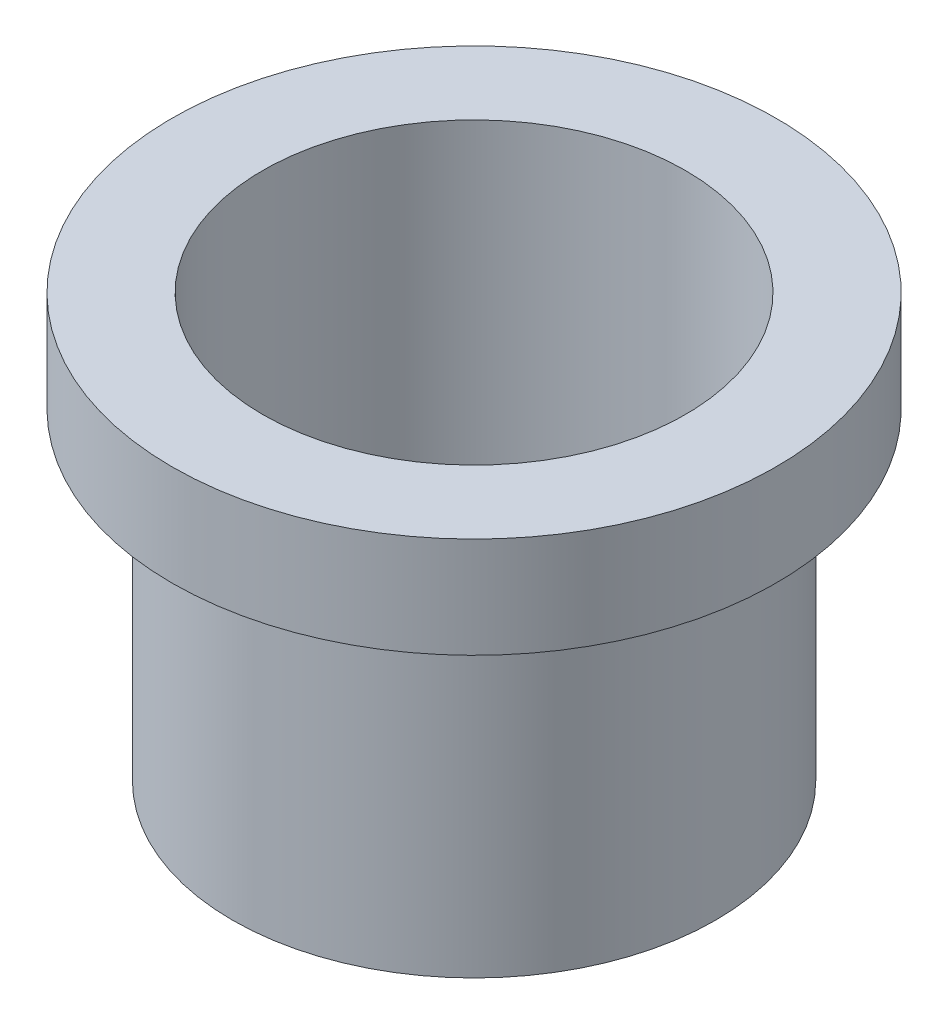
ISO-10303-21;
HEADER;
FILE_DESCRIPTION(('STEP AP214'),'2;1');
FILE_NAME('part.step','',(''),(''),'','','');
FILE_SCHEMA(('AUTOMOTIVE_DESIGN { 1 0 10303 214 1 1 1 1 }'));
ENDSEC;
DATA;
#1=APPLICATION_CONTEXT('core data for automotive mechanical design processes');
#2=APPLICATION_PROTOCOL_DEFINITION('international standard','automotive_design',2000,#1);
#3=PRODUCT_CONTEXT('',#1,'mechanical');
#4=PRODUCT('Part','Part','',(#3));
#5=PRODUCT_RELATED_PRODUCT_CATEGORY('part','',(#4));
#6=PRODUCT_DEFINITION_FORMATION('','',#4);
#7=PRODUCT_DEFINITION_CONTEXT('part definition',#1,'design');
#8=PRODUCT_DEFINITION('design','',#6,#7);
#9=PRODUCT_DEFINITION_SHAPE('','',#8);
#10=(LENGTH_UNIT() NAMED_UNIT(*) SI_UNIT(.MILLI.,.METRE.));
#11=(NAMED_UNIT(*) PLANE_ANGLE_UNIT() SI_UNIT($,.RADIAN.));
#12=(NAMED_UNIT(*) SI_UNIT($,.STERADIAN.) SOLID_ANGLE_UNIT());
#13=UNCERTAINTY_MEASURE_WITH_UNIT(LENGTH_MEASURE(1.E-05),#10,'distance_accuracy_value','');
#14=(GEOMETRIC_REPRESENTATION_CONTEXT(3) GLOBAL_UNCERTAINTY_ASSIGNED_CONTEXT((#13)) GLOBAL_UNIT_ASSIGNED_CONTEXT((#10,
#11,#12)) REPRESENTATION_CONTEXT('',''));
#15=CARTESIAN_POINT('',(0.,0.,0.));
#16=DIRECTION('',(0.,0.,1.));
#17=DIRECTION('',(1.,0.,0.));
#18=AXIS2_PLACEMENT_3D('',#15,#16,#17);
#19=CARTESIAN_POINT('',(0.,21.,0.));
#20=DIRECTION('',(0.,-1.,0.));
#21=DIRECTION('',(0.,0.,-1.));
#22=AXIS2_PLACEMENT_3D('',#19,#20,#21);
#23=PLANE('',#22);
#24=CARTESIAN_POINT('',(0.,21.,0.));
#25=DIRECTION('',(0.,1.,0.));
#26=DIRECTION('',(0.,0.,1.));
#27=AXIS2_PLACEMENT_3D('',#24,#25,#26);
#28=CIRCLE('',#27,10.5);
#29=CARTESIAN_POINT('',(0.,21.,10.5));
#30=VERTEX_POINT('',#29);
#31=EDGE_CURVE('E65',#30,#30,#28,.T.);
#32=ORIENTED_EDGE('',*,*,#31,.F.);
#33=EDGE_LOOP('',(#32));
#34=FACE_BOUND('',#33,.T.);
#35=CARTESIAN_POINT('',(0.,21.,0.));
#36=DIRECTION('',(0.,1.,0.));
#37=DIRECTION('',(0.,0.,1.));
#38=AXIS2_PLACEMENT_3D('',#35,#36,#37);
#39=CIRCLE('',#38,15.);
#40=CARTESIAN_POINT('',(0.,21.,15.));
#41=VERTEX_POINT('',#40);
#42=EDGE_CURVE('E10',#41,#41,#39,.T.);
#43=ORIENTED_EDGE('',*,*,#42,.T.);
#44=EDGE_LOOP('',(#43));
#45=FACE_BOUND('',#44,.T.);
#46=ADVANCED_FACE('F41',(#34,#45),#23,.F.);
#47=CARTESIAN_POINT('',(0.,64.7505030181086,0.));
#48=DIRECTION('',(0.,1.,0.));
#49=DIRECTION('',(0.,0.,1.));
#50=AXIS2_PLACEMENT_3D('',#47,#48,#49);
#51=CYLINDRICAL_SURFACE('',#50,15.);
#52=ORIENTED_EDGE('',*,*,#42,.F.);
#53=EDGE_LOOP('',(#52));
#54=FACE_BOUND('',#53,.T.);
#55=CARTESIAN_POINT('',(0.,16.,0.));
#56=DIRECTION('',(0.,1.,0.));
#57=DIRECTION('',(0.,0.,1.));
#58=AXIS2_PLACEMENT_3D('',#55,#56,#57);
#59=CIRCLE('',#58,15.);
#60=CARTESIAN_POINT('',(0.,16.,15.));
#61=VERTEX_POINT('',#60);
#62=EDGE_CURVE('E48',#61,#61,#59,.T.);
#63=ORIENTED_EDGE('',*,*,#62,.T.);
#64=EDGE_LOOP('',(#63));
#65=FACE_BOUND('',#64,.T.);
#66=ADVANCED_FACE('F83',(#54,#65),#51,.T.);
#67=CARTESIAN_POINT('',(15.,16.,0.));
#68=DIRECTION('',(0.,1.,0.));
#69=DIRECTION('',(0.,0.,1.));
#70=AXIS2_PLACEMENT_3D('',#67,#68,#69);
#71=PLANE('',#70);
#72=ORIENTED_EDGE('',*,*,#62,.F.);
#73=EDGE_LOOP('',(#72));
#74=FACE_BOUND('',#73,.T.);
#75=CARTESIAN_POINT('',(0.,16.,0.));
#76=DIRECTION('',(0.,1.,0.));
#77=DIRECTION('',(0.,0.,1.));
#78=AXIS2_PLACEMENT_3D('',#75,#76,#77);
#79=CIRCLE('',#78,12.);
#80=CARTESIAN_POINT('',(0.,16.,12.));
#81=VERTEX_POINT('',#80);
#82=EDGE_CURVE('E53',#81,#81,#79,.T.);
#83=ORIENTED_EDGE('',*,*,#82,.T.);
#84=EDGE_LOOP('',(#83));
#85=FACE_BOUND('',#84,.T.);
#86=ADVANCED_FACE('F87',(#74,#85),#71,.F.);
#87=CARTESIAN_POINT('',(0.,64.7505030181086,0.));
#88=DIRECTION('',(0.,1.,0.));
#89=DIRECTION('',(0.,0.,1.));
#90=AXIS2_PLACEMENT_3D('',#87,#88,#89);
#91=CYLINDRICAL_SURFACE('',#90,12.);
#92=ORIENTED_EDGE('',*,*,#82,.F.);
#93=EDGE_LOOP('',(#92));
#94=FACE_BOUND('',#93,.T.);
#95=CARTESIAN_POINT('',(0.,0.,0.));
#96=DIRECTION('',(0.,1.,0.));
#97=DIRECTION('',(0.,0.,1.));
#98=AXIS2_PLACEMENT_3D('',#95,#96,#97);
#99=CIRCLE('',#98,12.);
#100=CARTESIAN_POINT('',(0.,0.,12.));
#101=VERTEX_POINT('',#100);
#102=EDGE_CURVE('E58',#101,#101,#99,.T.);
#103=ORIENTED_EDGE('',*,*,#102,.T.);
#104=EDGE_LOOP('',(#103));
#105=FACE_BOUND('',#104,.T.);
#106=ADVANCED_FACE('F92',(#94,#105),#91,.T.);
#107=CARTESIAN_POINT('',(12.,0.,0.));
#108=DIRECTION('',(0.,1.,0.));
#109=DIRECTION('',(0.,0.,1.));
#110=AXIS2_PLACEMENT_3D('',#107,#108,#109);
#111=PLANE('',#110);
#112=CARTESIAN_POINT('',(0.,0.,0.));
#113=DIRECTION('',(0.,1.,0.));
#114=DIRECTION('',(0.,0.,1.));
#115=AXIS2_PLACEMENT_3D('',#112,#113,#114);
#116=CIRCLE('',#115,10.5);
#117=CARTESIAN_POINT('',(0.,0.,10.5));
#118=VERTEX_POINT('',#117);
#119=EDGE_CURVE('E64',#118,#118,#116,.T.);
#120=ORIENTED_EDGE('',*,*,#119,.T.);
#121=EDGE_LOOP('',(#120));
#122=FACE_BOUND('',#121,.T.);
#123=ORIENTED_EDGE('',*,*,#102,.F.);
#124=EDGE_LOOP('',(#123));
#125=FACE_BOUND('',#124,.T.);
#126=ADVANCED_FACE('F73',(#122,#125),#111,.F.);
#127=CARTESIAN_POINT('',(0.,0.,0.));
#128=DIRECTION('',(0.,1.,0.));
#129=DIRECTION('',(0.,0.,1.));
#130=AXIS2_PLACEMENT_3D('',#127,#128,#129);
#131=CYLINDRICAL_SURFACE('',#130,10.5);
#132=ORIENTED_EDGE('',*,*,#119,.F.);
#133=EDGE_LOOP('',(#132));
#134=FACE_BOUND('',#133,.T.);
#135=ORIENTED_EDGE('',*,*,#31,.T.);
#136=EDGE_LOOP('',(#135));
#137=FACE_BOUND('',#136,.T.);
#138=ADVANCED_FACE('F76',(#134,#137),#131,.F.);
#139=CLOSED_SHELL('',(#46,#66,#86,#106,#126,#138));
#140=MANIFOLD_SOLID_BREP('B2',#139);
#141=ADVANCED_BREP_SHAPE_REPRESENTATION('',(#18,#140),#14);
#142=SHAPE_DEFINITION_REPRESENTATION(#9,#141);
ENDSEC;
END-ISO-10303-21;
